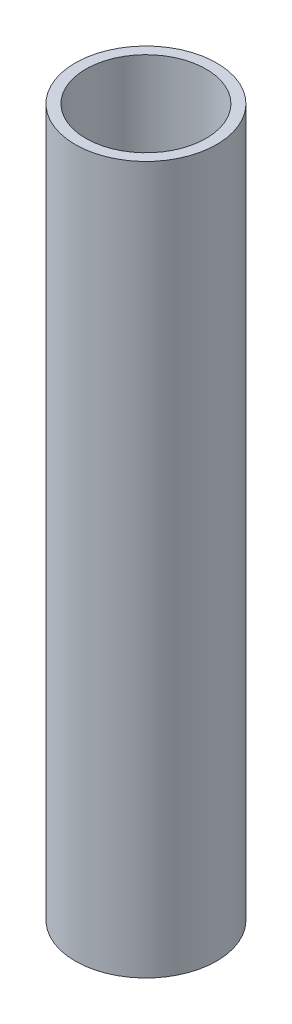
ISO-10303-21;
HEADER;
FILE_DESCRIPTION(('STEP AP214'),'2;1');
FILE_NAME('part.step','',(''),(''),'','','');
FILE_SCHEMA(('AUTOMOTIVE_DESIGN { 1 0 10303 214 1 1 1 1 }'));
ENDSEC;
DATA;
#1=APPLICATION_CONTEXT('core data for automotive mechanical design processes');
#2=APPLICATION_PROTOCOL_DEFINITION('international standard','automotive_design',2000,#1);
#3=PRODUCT_CONTEXT('',#1,'mechanical');
#4=PRODUCT('Part','Part','',(#3));
#5=PRODUCT_RELATED_PRODUCT_CATEGORY('part','',(#4));
#6=PRODUCT_DEFINITION_FORMATION('','',#4);
#7=PRODUCT_DEFINITION_CONTEXT('part definition',#1,'design');
#8=PRODUCT_DEFINITION('design','',#6,#7);
#9=PRODUCT_DEFINITION_SHAPE('','',#8);
#10=(LENGTH_UNIT() NAMED_UNIT(*) SI_UNIT(.MILLI.,.METRE.));
#11=(NAMED_UNIT(*) PLANE_ANGLE_UNIT() SI_UNIT($,.RADIAN.));
#12=(NAMED_UNIT(*) SI_UNIT($,.STERADIAN.) SOLID_ANGLE_UNIT());
#13=UNCERTAINTY_MEASURE_WITH_UNIT(LENGTH_MEASURE(1.E-05),#10,'distance_accuracy_value','');
#14=(GEOMETRIC_REPRESENTATION_CONTEXT(3) GLOBAL_UNCERTAINTY_ASSIGNED_CONTEXT((#13)) GLOBAL_UNIT_ASSIGNED_CONTEXT((#10,
#11,#12)) REPRESENTATION_CONTEXT('',''));
#15=CARTESIAN_POINT('',(0.,0.,0.));
#16=DIRECTION('',(0.,0.,1.));
#17=DIRECTION('',(1.,0.,0.));
#18=AXIS2_PLACEMENT_3D('',#15,#16,#17);
#19=CARTESIAN_POINT('',(0.,100.,0.));
#20=DIRECTION('',(0.,-1.,0.));
#21=DIRECTION('',(0.,0.,-1.));
#22=AXIS2_PLACEMENT_3D('',#19,#20,#21);
#23=CYLINDRICAL_SURFACE('',#22,10.);
#24=CARTESIAN_POINT('',(0.,100.,0.));
#25=DIRECTION('',(0.,1.,0.));
#26=DIRECTION('',(0.,0.,1.));
#27=AXIS2_PLACEMENT_3D('',#24,#25,#26);
#28=CIRCLE('',#27,10.);
#29=CARTESIAN_POINT('',(0.,100.,10.));
#30=VERTEX_POINT('',#29);
#31=EDGE_CURVE('E10',#30,#30,#28,.T.);
#32=ORIENTED_EDGE('',*,*,#31,.F.);
#33=EDGE_LOOP('',(#32));
#34=FACE_BOUND('',#33,.T.);
#35=CARTESIAN_POINT('',(0.,0.,0.));
#36=DIRECTION('',(0.,1.,0.));
#37=DIRECTION('',(0.,0.,1.));
#38=AXIS2_PLACEMENT_3D('',#35,#36,#37);
#39=CIRCLE('',#38,10.);
#40=CARTESIAN_POINT('',(0.,0.,10.));
#41=VERTEX_POINT('',#40);
#42=EDGE_CURVE('E42',#41,#41,#39,.T.);
#43=ORIENTED_EDGE('',*,*,#42,.T.);
#44=EDGE_LOOP('',(#43));
#45=FACE_BOUND('',#44,.T.);
#46=ADVANCED_FACE('F35',(#34,#45),#23,.T.);
#47=CARTESIAN_POINT('',(0.,100.,0.));
#48=DIRECTION('',(0.,1.,0.));
#49=DIRECTION('',(0.,0.,1.));
#50=AXIS2_PLACEMENT_3D('',#47,#48,#49);
#51=PLANE('',#50);
#52=CARTESIAN_POINT('',(0.,100.,0.));
#53=DIRECTION('',(0.,1.,0.));
#54=DIRECTION('',(0.,0.,1.));
#55=AXIS2_PLACEMENT_3D('',#52,#53,#54);
#56=CIRCLE('',#55,8.5);
#57=CARTESIAN_POINT('',(0.,100.,8.5));
#58=VERTEX_POINT('',#57);
#59=EDGE_CURVE('E48',#58,#58,#56,.T.);
#60=ORIENTED_EDGE('',*,*,#59,.F.);
#61=EDGE_LOOP('',(#60));
#62=FACE_BOUND('',#61,.T.);
#63=ORIENTED_EDGE('',*,*,#31,.T.);
#64=EDGE_LOOP('',(#63));
#65=FACE_BOUND('',#64,.T.);
#66=ADVANCED_FACE('F64',(#62,#65),#51,.T.);
#67=CARTESIAN_POINT('',(0.,0.,0.));
#68=DIRECTION('',(0.,1.,0.));
#69=DIRECTION('',(0.,0.,1.));
#70=AXIS2_PLACEMENT_3D('',#67,#68,#69);
#71=PLANE('',#70);
#72=CARTESIAN_POINT('',(0.,0.,0.));
#73=DIRECTION('',(0.,1.,0.));
#74=DIRECTION('',(0.,0.,1.));
#75=AXIS2_PLACEMENT_3D('',#72,#73,#74);
#76=CIRCLE('',#75,8.5);
#77=CARTESIAN_POINT('',(0.,0.,8.5));
#78=VERTEX_POINT('',#77);
#79=EDGE_CURVE('E38',#78,#78,#76,.T.);
#80=ORIENTED_EDGE('',*,*,#79,.T.);
#81=EDGE_LOOP('',(#80));
#82=FACE_BOUND('',#81,.T.);
#83=ORIENTED_EDGE('',*,*,#42,.F.);
#84=EDGE_LOOP('',(#83));
#85=FACE_BOUND('',#84,.T.);
#86=ADVANCED_FACE('F55',(#82,#85),#71,.F.);
#87=CARTESIAN_POINT('',(0.,-100.,0.));
#88=DIRECTION('',(0.,1.,0.));
#89=DIRECTION('',(0.,0.,1.));
#90=AXIS2_PLACEMENT_3D('',#87,#88,#89);
#91=CYLINDRICAL_SURFACE('',#90,8.5);
#92=ORIENTED_EDGE('',*,*,#59,.T.);
#93=EDGE_LOOP('',(#92));
#94=FACE_BOUND('',#93,.T.);
#95=ORIENTED_EDGE('',*,*,#79,.F.);
#96=EDGE_LOOP('',(#95));
#97=FACE_BOUND('',#96,.T.);
#98=ADVANCED_FACE('F58',(#94,#97),#91,.F.);
#99=CLOSED_SHELL('',(#46,#66,#86,#98));
#100=MANIFOLD_SOLID_BREP('B2',#99);
#101=ADVANCED_BREP_SHAPE_REPRESENTATION('',(#18,#100),#14);
#102=SHAPE_DEFINITION_REPRESENTATION(#9,#101);
ENDSEC;
END-ISO-10303-21;
